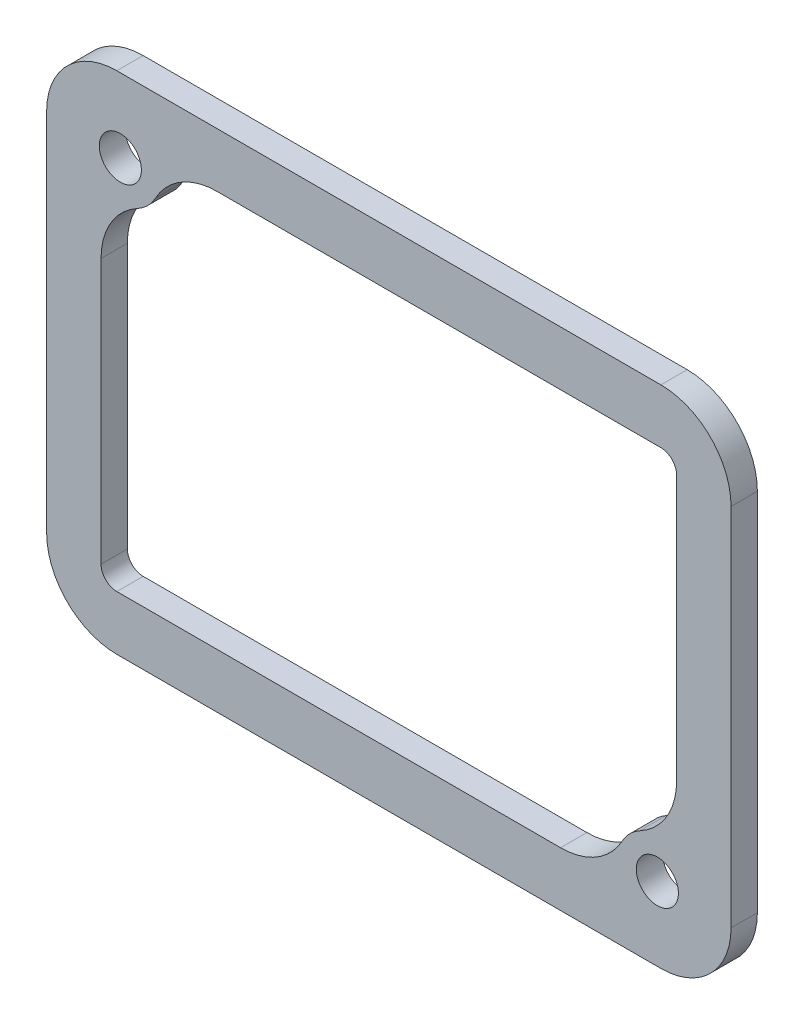
ISO-10303-21;
HEADER;
FILE_DESCRIPTION(('STEP AP214'),'2;1');
FILE_NAME('part.step','',(''),(''),'','','');
FILE_SCHEMA(('AUTOMOTIVE_DESIGN { 1 0 10303 214 1 1 1 1 }'));
ENDSEC;
DATA;
#1=APPLICATION_CONTEXT('core data for automotive mechanical design processes');
#2=APPLICATION_PROTOCOL_DEFINITION('international standard','automotive_design',2000,#1);
#3=PRODUCT_CONTEXT('',#1,'mechanical');
#4=PRODUCT('Part','Part','',(#3));
#5=PRODUCT_RELATED_PRODUCT_CATEGORY('part','',(#4));
#6=PRODUCT_DEFINITION_FORMATION('','',#4);
#7=PRODUCT_DEFINITION_CONTEXT('part definition',#1,'design');
#8=PRODUCT_DEFINITION('design','',#6,#7);
#9=PRODUCT_DEFINITION_SHAPE('','',#8);
#10=(LENGTH_UNIT() NAMED_UNIT(*) SI_UNIT(.MILLI.,.METRE.));
#11=(NAMED_UNIT(*) PLANE_ANGLE_UNIT() SI_UNIT($,.RADIAN.));
#12=(NAMED_UNIT(*) SI_UNIT($,.STERADIAN.) SOLID_ANGLE_UNIT());
#13=UNCERTAINTY_MEASURE_WITH_UNIT(LENGTH_MEASURE(1.E-05),#10,'distance_accuracy_value','');
#14=(GEOMETRIC_REPRESENTATION_CONTEXT(3) GLOBAL_UNCERTAINTY_ASSIGNED_CONTEXT((#13)) GLOBAL_UNIT_ASSIGNED_CONTEXT((#10,
#11,#12)) REPRESENTATION_CONTEXT('',''));
#15=CARTESIAN_POINT('',(0.,0.,0.));
#16=DIRECTION('',(0.,0.,1.));
#17=DIRECTION('',(1.,0.,0.));
#18=AXIS2_PLACEMENT_3D('',#15,#16,#17);
#19=CARTESIAN_POINT('',(-15.5,-10.4,1.5));
#20=DIRECTION('',(0.,0.,-1.));
#21=DIRECTION('',(-1.,0.,0.));
#22=AXIS2_PLACEMENT_3D('',#19,#20,#21);
#23=CYLINDRICAL_SURFACE('',#22,4.);
#24=CARTESIAN_POINT('',(-15.5,-10.4,0.));
#25=DIRECTION('',(0.,0.,1.));
#26=DIRECTION('',(-1.,0.,0.));
#27=AXIS2_PLACEMENT_3D('',#24,#25,#26);
#28=CIRCLE('',#27,4.);
#29=CARTESIAN_POINT('',(-19.5,-10.4,0.));
#30=VERTEX_POINT('',#29);
#31=CARTESIAN_POINT('',(-15.5,-14.4,0.));
#32=VERTEX_POINT('',#31);
#33=EDGE_CURVE('E260',#30,#32,#28,.T.);
#34=ORIENTED_EDGE('',*,*,#33,.T.);
#35=DIRECTION('',(0.,0.,-1.));
#36=VECTOR('',#35,1.);
#37=CARTESIAN_POINT('',(-15.5,-14.4,1.5));
#38=LINE('',#37,#36);
#39=CARTESIAN_POINT('',(-15.5,-14.4,1.5));
#40=VERTEX_POINT('',#39);
#41=EDGE_CURVE('E11',#40,#32,#38,.T.);
#42=ORIENTED_EDGE('',*,*,#41,.F.);
#43=CARTESIAN_POINT('',(-15.5,-10.4,1.5));
#44=DIRECTION('',(0.,0.,1.));
#45=DIRECTION('',(-1.,0.,0.));
#46=AXIS2_PLACEMENT_3D('',#43,#44,#45);
#47=CIRCLE('',#46,4.);
#48=CARTESIAN_POINT('',(-19.5,-10.4,1.5));
#49=VERTEX_POINT('',#48);
#50=EDGE_CURVE('E280',#49,#40,#47,.T.);
#51=ORIENTED_EDGE('',*,*,#50,.F.);
#52=DIRECTION('',(0.,0.,-1.));
#53=VECTOR('',#52,1.);
#54=CARTESIAN_POINT('',(-19.5,-10.4,1.5));
#55=LINE('',#54,#53);
#56=EDGE_CURVE('E298',#49,#30,#55,.T.);
#57=ORIENTED_EDGE('',*,*,#56,.T.);
#58=EDGE_LOOP('',(#34,#42,#51,#57));
#59=FACE_BOUND('',#58,.T.);
#60=ADVANCED_FACE('F39',(#59),#23,.T.);
#61=CARTESIAN_POINT('',(15.5,-14.4,1.5));
#62=DIRECTION('',(0.,1.,0.));
#63=DIRECTION('',(-1.,0.,0.));
#64=AXIS2_PLACEMENT_3D('',#61,#62,#63);
#65=PLANE('',#64);
#66=DIRECTION('',(1.,0.,0.));
#67=VECTOR('',#66,1.);
#68=CARTESIAN_POINT('',(15.5,-14.4,0.));
#69=LINE('',#68,#67);
#70=CARTESIAN_POINT('',(15.5,-14.4,0.));
#71=VERTEX_POINT('',#70);
#72=EDGE_CURVE('E301',#32,#71,#69,.T.);
#73=ORIENTED_EDGE('',*,*,#72,.T.);
#74=DIRECTION('',(0.,0.,-1.));
#75=VECTOR('',#74,1.);
#76=CARTESIAN_POINT('',(15.5,-14.4,1.5));
#77=LINE('',#76,#75);
#78=CARTESIAN_POINT('',(15.5,-14.4,1.5));
#79=VERTEX_POINT('',#78);
#80=EDGE_CURVE('E46',#79,#71,#77,.T.);
#81=ORIENTED_EDGE('',*,*,#80,.F.);
#82=DIRECTION('',(1.,0.,0.));
#83=VECTOR('',#82,1.);
#84=CARTESIAN_POINT('',(15.5,-14.4,1.5));
#85=LINE('',#84,#83);
#86=EDGE_CURVE('E283',#40,#79,#85,.T.);
#87=ORIENTED_EDGE('',*,*,#86,.F.);
#88=ORIENTED_EDGE('',*,*,#41,.T.);
#89=EDGE_LOOP('',(#73,#81,#87,#88));
#90=FACE_BOUND('',#89,.T.);
#91=ADVANCED_FACE('F356',(#90),#65,.F.);
#92=CARTESIAN_POINT('',(15.5,-10.4,1.5));
#93=DIRECTION('',(0.,0.,-1.));
#94=DIRECTION('',(-1.,0.,0.));
#95=AXIS2_PLACEMENT_3D('',#92,#93,#94);
#96=CYLINDRICAL_SURFACE('',#95,4.);
#97=CARTESIAN_POINT('',(15.5,-10.4,0.));
#98=DIRECTION('',(0.,0.,1.));
#99=DIRECTION('',(1.,0.,0.));
#100=AXIS2_PLACEMENT_3D('',#97,#98,#99);
#101=CIRCLE('',#100,4.);
#102=CARTESIAN_POINT('',(19.5,-10.4,0.));
#103=VERTEX_POINT('',#102);
#104=EDGE_CURVE('E303',#71,#103,#101,.T.);
#105=ORIENTED_EDGE('',*,*,#104,.T.);
#106=DIRECTION('',(0.,0.,-1.));
#107=VECTOR('',#106,1.);
#108=CARTESIAN_POINT('',(19.5,-10.4,1.5));
#109=LINE('',#108,#107);
#110=CARTESIAN_POINT('',(19.5,-10.4,1.5));
#111=VERTEX_POINT('',#110);
#112=EDGE_CURVE('E328',#111,#103,#109,.T.);
#113=ORIENTED_EDGE('',*,*,#112,.F.);
#114=CARTESIAN_POINT('',(15.5,-10.4,1.5));
#115=DIRECTION('',(0.,0.,1.));
#116=DIRECTION('',(1.,0.,0.));
#117=AXIS2_PLACEMENT_3D('',#114,#115,#116);
#118=CIRCLE('',#117,4.);
#119=EDGE_CURVE('E286',#79,#111,#118,.T.);
#120=ORIENTED_EDGE('',*,*,#119,.F.);
#121=ORIENTED_EDGE('',*,*,#80,.T.);
#122=EDGE_LOOP('',(#105,#113,#120,#121));
#123=FACE_BOUND('',#122,.T.);
#124=ADVANCED_FACE('F335',(#123),#96,.T.);
#125=CARTESIAN_POINT('',(19.5,-10.4,1.5));
#126=DIRECTION('',(-1.,0.,0.));
#127=DIRECTION('',(0.,0.,1.));
#128=AXIS2_PLACEMENT_3D('',#125,#126,#127);
#129=PLANE('',#128);
#130=DIRECTION('',(0.,1.,0.));
#131=VECTOR('',#130,1.);
#132=CARTESIAN_POINT('',(19.5,-10.4,0.));
#133=LINE('',#132,#131);
#134=CARTESIAN_POINT('',(19.5,10.4,0.));
#135=VERTEX_POINT('',#134);
#136=EDGE_CURVE('E305',#103,#135,#133,.T.);
#137=ORIENTED_EDGE('',*,*,#136,.T.);
#138=DIRECTION('',(0.,0.,-1.));
#139=VECTOR('',#138,1.);
#140=CARTESIAN_POINT('',(19.5,10.4,1.5));
#141=LINE('',#140,#139);
#142=CARTESIAN_POINT('',(19.5,10.4,1.5));
#143=VERTEX_POINT('',#142);
#144=EDGE_CURVE('E325',#143,#135,#141,.T.);
#145=ORIENTED_EDGE('',*,*,#144,.F.);
#146=DIRECTION('',(0.,1.,0.));
#147=VECTOR('',#146,1.);
#148=CARTESIAN_POINT('',(19.5,-10.4,1.5));
#149=LINE('',#148,#147);
#150=EDGE_CURVE('E288',#111,#143,#149,.T.);
#151=ORIENTED_EDGE('',*,*,#150,.F.);
#152=ORIENTED_EDGE('',*,*,#112,.T.);
#153=EDGE_LOOP('',(#137,#145,#151,#152));
#154=FACE_BOUND('',#153,.T.);
#155=ADVANCED_FACE('F344',(#154),#129,.F.);
#156=CARTESIAN_POINT('',(15.5,10.4,1.5));
#157=DIRECTION('',(0.,0.,-1.));
#158=DIRECTION('',(-1.,0.,0.));
#159=AXIS2_PLACEMENT_3D('',#156,#157,#158);
#160=CYLINDRICAL_SURFACE('',#159,4.);
#161=CARTESIAN_POINT('',(15.5,10.4,0.));
#162=DIRECTION('',(0.,0.,1.));
#163=DIRECTION('',(1.,0.,0.));
#164=AXIS2_PLACEMENT_3D('',#161,#162,#163);
#165=CIRCLE('',#164,4.);
#166=CARTESIAN_POINT('',(15.5,14.4,0.));
#167=VERTEX_POINT('',#166);
#168=EDGE_CURVE('E307',#135,#167,#165,.T.);
#169=ORIENTED_EDGE('',*,*,#168,.T.);
#170=DIRECTION('',(0.,0.,-1.));
#171=VECTOR('',#170,1.);
#172=CARTESIAN_POINT('',(15.5,14.4,1.5));
#173=LINE('',#172,#171);
#174=CARTESIAN_POINT('',(15.5,14.4,1.5));
#175=VERTEX_POINT('',#174);
#176=EDGE_CURVE('E322',#175,#167,#173,.T.);
#177=ORIENTED_EDGE('',*,*,#176,.F.);
#178=CARTESIAN_POINT('',(15.5,10.4,1.5));
#179=DIRECTION('',(0.,0.,1.));
#180=DIRECTION('',(1.,0.,0.));
#181=AXIS2_PLACEMENT_3D('',#178,#179,#180);
#182=CIRCLE('',#181,4.);
#183=EDGE_CURVE('E290',#143,#175,#182,.T.);
#184=ORIENTED_EDGE('',*,*,#183,.F.);
#185=ORIENTED_EDGE('',*,*,#144,.T.);
#186=EDGE_LOOP('',(#169,#177,#184,#185));
#187=FACE_BOUND('',#186,.T.);
#188=ADVANCED_FACE('F348',(#187),#160,.T.);
#189=CARTESIAN_POINT('',(15.5,14.4,1.5));
#190=DIRECTION('',(0.,-1.,0.));
#191=DIRECTION('',(1.,0.,0.));
#192=AXIS2_PLACEMENT_3D('',#189,#190,#191);
#193=PLANE('',#192);
#194=DIRECTION('',(-1.,0.,0.));
#195=VECTOR('',#194,1.);
#196=CARTESIAN_POINT('',(15.5,14.4,0.));
#197=LINE('',#196,#195);
#198=CARTESIAN_POINT('',(-15.5,14.4,0.));
#199=VERTEX_POINT('',#198);
#200=EDGE_CURVE('E309',#167,#199,#197,.T.);
#201=ORIENTED_EDGE('',*,*,#200,.T.);
#202=DIRECTION('',(0.,0.,-1.));
#203=VECTOR('',#202,1.);
#204=CARTESIAN_POINT('',(-15.5,14.4,1.5));
#205=LINE('',#204,#203);
#206=CARTESIAN_POINT('',(-15.5,14.4,1.5));
#207=VERTEX_POINT('',#206);
#208=EDGE_CURVE('E319',#207,#199,#205,.T.);
#209=ORIENTED_EDGE('',*,*,#208,.F.);
#210=DIRECTION('',(-1.,0.,0.));
#211=VECTOR('',#210,1.);
#212=CARTESIAN_POINT('',(15.5,14.4,1.5));
#213=LINE('',#212,#211);
#214=EDGE_CURVE('E292',#175,#207,#213,.T.);
#215=ORIENTED_EDGE('',*,*,#214,.F.);
#216=ORIENTED_EDGE('',*,*,#176,.T.);
#217=EDGE_LOOP('',(#201,#209,#215,#216));
#218=FACE_BOUND('',#217,.T.);
#219=ADVANCED_FACE('F369',(#218),#193,.F.);
#220=CARTESIAN_POINT('',(-15.5,10.4,1.5));
#221=DIRECTION('',(0.,0.,-1.));
#222=DIRECTION('',(-1.,0.,0.));
#223=AXIS2_PLACEMENT_3D('',#220,#221,#222);
#224=CYLINDRICAL_SURFACE('',#223,4.);
#225=CARTESIAN_POINT('',(-15.5,10.4,0.));
#226=DIRECTION('',(0.,0.,1.));
#227=DIRECTION('',(1.,0.,0.));
#228=AXIS2_PLACEMENT_3D('',#225,#226,#227);
#229=CIRCLE('',#228,4.);
#230=CARTESIAN_POINT('',(-19.5,10.4,0.));
#231=VERTEX_POINT('',#230);
#232=EDGE_CURVE('E311',#199,#231,#229,.T.);
#233=ORIENTED_EDGE('',*,*,#232,.T.);
#234=DIRECTION('',(0.,0.,-1.));
#235=VECTOR('',#234,1.);
#236=CARTESIAN_POINT('',(-19.5,10.4,1.5));
#237=LINE('',#236,#235);
#238=CARTESIAN_POINT('',(-19.5,10.4,1.5));
#239=VERTEX_POINT('',#238);
#240=EDGE_CURVE('E316',#239,#231,#237,.T.);
#241=ORIENTED_EDGE('',*,*,#240,.F.);
#242=CARTESIAN_POINT('',(-15.5,10.4,1.5));
#243=DIRECTION('',(0.,0.,1.));
#244=DIRECTION('',(1.,0.,0.));
#245=AXIS2_PLACEMENT_3D('',#242,#243,#244);
#246=CIRCLE('',#245,4.);
#247=EDGE_CURVE('E294',#207,#239,#246,.T.);
#248=ORIENTED_EDGE('',*,*,#247,.F.);
#249=ORIENTED_EDGE('',*,*,#208,.T.);
#250=EDGE_LOOP('',(#233,#241,#248,#249));
#251=FACE_BOUND('',#250,.T.);
#252=ADVANCED_FACE('F367',(#251),#224,.T.);
#253=CARTESIAN_POINT('',(-19.5,-10.4,1.5));
#254=DIRECTION('',(1.,0.,0.));
#255=DIRECTION('',(0.,1.,0.));
#256=AXIS2_PLACEMENT_3D('',#253,#254,#255);
#257=PLANE('',#256);
#258=DIRECTION('',(0.,-1.,0.));
#259=VECTOR('',#258,1.);
#260=CARTESIAN_POINT('',(-19.5,-10.4,0.));
#261=LINE('',#260,#259);
#262=EDGE_CURVE('E284',#231,#30,#261,.T.);
#263=ORIENTED_EDGE('',*,*,#262,.T.);
#264=ORIENTED_EDGE('',*,*,#56,.F.);
#265=DIRECTION('',(0.,-1.,0.));
#266=VECTOR('',#265,1.);
#267=CARTESIAN_POINT('',(-19.5,-10.4,1.5));
#268=LINE('',#267,#266);
#269=EDGE_CURVE('E296',#239,#49,#268,.T.);
#270=ORIENTED_EDGE('',*,*,#269,.F.);
#271=ORIENTED_EDGE('',*,*,#240,.T.);
#272=EDGE_LOOP('',(#263,#264,#270,#271));
#273=FACE_BOUND('',#272,.T.);
#274=ADVANCED_FACE('F362',(#273),#257,.F.);
#275=CARTESIAN_POINT('',(-15.5,-10.4,1.5));
#276=DIRECTION('',(0.,0.,-1.));
#277=DIRECTION('',(-1.,0.,0.));
#278=AXIS2_PLACEMENT_3D('',#275,#276,#277);
#279=PLANE('',#278);
#280=CARTESIAN_POINT('',(-15.3,10.2,1.5));
#281=DIRECTION('',(0.,0.,1.));
#282=DIRECTION('',(1.,0.,0.));
#283=AXIS2_PLACEMENT_3D('',#280,#281,#282);
#284=CIRCLE('',#283,1.2);
#285=CARTESIAN_POINT('',(-14.1,10.2,1.5));
#286=VERTEX_POINT('',#285);
#287=EDGE_CURVE('E577',#286,#286,#284,.T.);
#288=ORIENTED_EDGE('',*,*,#287,.F.);
#289=EDGE_LOOP('',(#288));
#290=FACE_BOUND('',#289,.T.);
#291=CARTESIAN_POINT('',(15.3,-10.2,1.5));
#292=DIRECTION('',(0.,0.,1.));
#293=DIRECTION('',(1.,0.,0.));
#294=AXIS2_PLACEMENT_3D('',#291,#292,#293);
#295=CIRCLE('',#294,1.2);
#296=CARTESIAN_POINT('',(16.5,-10.2,1.5));
#297=VERTEX_POINT('',#296);
#298=EDGE_CURVE('E578',#297,#297,#295,.T.);
#299=ORIENTED_EDGE('',*,*,#298,.F.);
#300=EDGE_LOOP('',(#299));
#301=FACE_BOUND('',#300,.T.);
#302=DIRECTION('',(-1.,0.,0.));
#303=VECTOR('',#302,1.);
#304=CARTESIAN_POINT('',(15.5,11.3,1.5));
#305=LINE('',#304,#303);
#306=CARTESIAN_POINT('',(15.5,11.3,1.5));
#307=VERTEX_POINT('',#306);
#308=CARTESIAN_POINT('',(-9.78685725716573,11.3,1.5));
#309=VERTEX_POINT('',#308);
#310=EDGE_CURVE('E229',#307,#309,#305,.T.);
#311=ORIENTED_EDGE('',*,*,#310,.F.);
#312=CARTESIAN_POINT('',(15.5,10.4,1.5));
#313=DIRECTION('',(0.,0.,1.));
#314=DIRECTION('',(1.,0.,0.));
#315=AXIS2_PLACEMENT_3D('',#312,#313,#314);
#316=CIRCLE('',#315,0.899999999999998);
#317=CARTESIAN_POINT('',(16.4,10.4,1.5));
#318=VERTEX_POINT('',#317);
#319=EDGE_CURVE('E53',#318,#307,#316,.T.);
#320=ORIENTED_EDGE('',*,*,#319,.F.);
#321=DIRECTION('',(0.,1.,0.));
#322=VECTOR('',#321,1.);
#323=CARTESIAN_POINT('',(16.4,-4.68685725716572,1.5));
#324=LINE('',#323,#322);
#325=CARTESIAN_POINT('',(16.4,-4.68685725716572,1.5));
#326=VERTEX_POINT('',#325);
#327=EDGE_CURVE('E194',#326,#318,#324,.T.);
#328=ORIENTED_EDGE('',*,*,#327,.F.);
#329=CARTESIAN_POINT('',(12.4,-4.68685725716572,1.5));
#330=DIRECTION('',(0.,0.,1.));
#331=DIRECTION('',(1.,0.,0.));
#332=AXIS2_PLACEMENT_3D('',#329,#330,#331);
#333=CIRCLE('',#332,4.);
#334=CARTESIAN_POINT('',(14.3076923076923,-8.2026374066022,1.5));
#335=VERTEX_POINT('',#334);
#336=EDGE_CURVE('E197',#335,#326,#333,.T.);
#337=ORIENTED_EDGE('',*,*,#336,.F.);
#338=CARTESIAN_POINT('',(15.5,-10.4,1.5));
#339=DIRECTION('',(0.,0.,-1.));
#340=DIRECTION('',(1.,0.,0.));
#341=AXIS2_PLACEMENT_3D('',#338,#339,#340);
#342=CIRCLE('',#341,2.5);
#343=CARTESIAN_POINT('',(13.3026374066022,-9.20769230769231,1.5));
#344=VERTEX_POINT('',#343);
#345=EDGE_CURVE('E253',#344,#335,#342,.T.);
#346=ORIENTED_EDGE('',*,*,#345,.F.);
#347=CARTESIAN_POINT('',(9.78685725716572,-7.3,1.5));
#348=DIRECTION('',(0.,0.,1.));
#349=DIRECTION('',(-1.,0.,0.));
#350=AXIS2_PLACEMENT_3D('',#347,#348,#349);
#351=CIRCLE('',#350,4.);
#352=CARTESIAN_POINT('',(9.78685725716572,-11.3,1.5));
#353=VERTEX_POINT('',#352);
#354=EDGE_CURVE('E250',#353,#344,#351,.T.);
#355=ORIENTED_EDGE('',*,*,#354,.F.);
#356=DIRECTION('',(1.,0.,0.));
#357=VECTOR('',#356,1.);
#358=CARTESIAN_POINT('',(-15.5,-11.3,1.5));
#359=LINE('',#358,#357);
#360=CARTESIAN_POINT('',(-15.5,-11.3,1.5));
#361=VERTEX_POINT('',#360);
#362=EDGE_CURVE('E247',#361,#353,#359,.T.);
#363=ORIENTED_EDGE('',*,*,#362,.F.);
#364=CARTESIAN_POINT('',(-15.5,-10.4,1.5));
#365=DIRECTION('',(0.,0.,1.));
#366=DIRECTION('',(1.,0.,0.));
#367=AXIS2_PLACEMENT_3D('',#364,#365,#366);
#368=CIRCLE('',#367,0.899999999999995);
#369=CARTESIAN_POINT('',(-16.4,-10.4,1.5));
#370=VERTEX_POINT('',#369);
#371=EDGE_CURVE('E244',#370,#361,#368,.T.);
#372=ORIENTED_EDGE('',*,*,#371,.F.);
#373=DIRECTION('',(0.,-1.,0.));
#374=VECTOR('',#373,1.);
#375=CARTESIAN_POINT('',(-16.4,4.68685725716572,1.5));
#376=LINE('',#375,#374);
#377=CARTESIAN_POINT('',(-16.4,4.68685725716572,1.5));
#378=VERTEX_POINT('',#377);
#379=EDGE_CURVE('E241',#378,#370,#376,.T.);
#380=ORIENTED_EDGE('',*,*,#379,.F.);
#381=CARTESIAN_POINT('',(-12.4,4.68685725716572,1.5));
#382=DIRECTION('',(0.,0.,1.));
#383=DIRECTION('',(1.,0.,0.));
#384=AXIS2_PLACEMENT_3D('',#381,#382,#383);
#385=CIRCLE('',#384,4.);
#386=CARTESIAN_POINT('',(-14.3076923076923,8.2026374066022,1.5));
#387=VERTEX_POINT('',#386);
#388=EDGE_CURVE('E238',#387,#378,#385,.T.);
#389=ORIENTED_EDGE('',*,*,#388,.F.);
#390=CARTESIAN_POINT('',(-15.5,10.4,1.5));
#391=DIRECTION('',(0.,0.,-1.));
#392=DIRECTION('',(1.,0.,0.));
#393=AXIS2_PLACEMENT_3D('',#390,#391,#392);
#394=CIRCLE('',#393,2.5);
#395=CARTESIAN_POINT('',(-13.3026374066022,9.2076923076923,1.5));
#396=VERTEX_POINT('',#395);
#397=EDGE_CURVE('E235',#396,#387,#394,.T.);
#398=ORIENTED_EDGE('',*,*,#397,.F.);
#399=CARTESIAN_POINT('',(-9.78685725716573,7.29999999999999,1.5));
#400=DIRECTION('',(0.,0.,1.));
#401=DIRECTION('',(-1.,0.,0.));
#402=AXIS2_PLACEMENT_3D('',#399,#400,#401);
#403=CIRCLE('',#402,4.);
#404=EDGE_CURVE('E232',#309,#396,#403,.T.);
#405=ORIENTED_EDGE('',*,*,#404,.F.);
#406=EDGE_LOOP('',(#311,#320,#328,#337,#346,#355,#363,#372,#380,#389,#398,#405));
#407=FACE_BOUND('',#406,.T.);
#408=ORIENTED_EDGE('',*,*,#50,.T.);
#409=ORIENTED_EDGE('',*,*,#86,.T.);
#410=ORIENTED_EDGE('',*,*,#119,.T.);
#411=ORIENTED_EDGE('',*,*,#150,.T.);
#412=ORIENTED_EDGE('',*,*,#183,.T.);
#413=ORIENTED_EDGE('',*,*,#214,.T.);
#414=ORIENTED_EDGE('',*,*,#247,.T.);
#415=ORIENTED_EDGE('',*,*,#269,.T.);
#416=EDGE_LOOP('',(#408,#409,#410,#411,#412,#413,#414,#415));
#417=FACE_BOUND('',#416,.T.);
#418=ADVANCED_FACE('F352',(#290,#301,#407,#417),#279,.F.);
#419=CARTESIAN_POINT('',(-15.5,-10.4,0.));
#420=DIRECTION('',(0.,0.,-1.));
#421=DIRECTION('',(-1.,0.,0.));
#422=AXIS2_PLACEMENT_3D('',#419,#420,#421);
#423=PLANE('',#422);
#424=CARTESIAN_POINT('',(-15.3,10.2,0.));
#425=DIRECTION('',(0.,0.,1.));
#426=DIRECTION('',(1.,0.,0.));
#427=AXIS2_PLACEMENT_3D('',#424,#425,#426);
#428=CIRCLE('',#427,1.2);
#429=CARTESIAN_POINT('',(-14.1,10.2,0.));
#430=VERTEX_POINT('',#429);
#431=EDGE_CURVE('E230',#430,#430,#428,.T.);
#432=ORIENTED_EDGE('',*,*,#431,.T.);
#433=EDGE_LOOP('',(#432));
#434=FACE_BOUND('',#433,.T.);
#435=CARTESIAN_POINT('',(15.3,-10.2,0.));
#436=DIRECTION('',(0.,0.,1.));
#437=DIRECTION('',(1.,0.,0.));
#438=AXIS2_PLACEMENT_3D('',#435,#436,#437);
#439=CIRCLE('',#438,1.2);
#440=CARTESIAN_POINT('',(16.5,-10.2,0.));
#441=VERTEX_POINT('',#440);
#442=EDGE_CURVE('E200',#441,#441,#439,.T.);
#443=ORIENTED_EDGE('',*,*,#442,.T.);
#444=EDGE_LOOP('',(#443));
#445=FACE_BOUND('',#444,.T.);
#446=CARTESIAN_POINT('',(15.5,10.4,0.));
#447=DIRECTION('',(0.,0.,1.));
#448=DIRECTION('',(1.,0.,0.));
#449=AXIS2_PLACEMENT_3D('',#446,#447,#448);
#450=CIRCLE('',#449,0.899999999999998);
#451=CARTESIAN_POINT('',(16.4,10.4,0.));
#452=VERTEX_POINT('',#451);
#453=CARTESIAN_POINT('',(15.5,11.3,0.));
#454=VERTEX_POINT('',#453);
#455=EDGE_CURVE('E177',#452,#454,#450,.T.);
#456=ORIENTED_EDGE('',*,*,#455,.T.);
#457=DIRECTION('',(-1.,0.,0.));
#458=VECTOR('',#457,1.);
#459=CARTESIAN_POINT('',(15.5,11.3,0.));
#460=LINE('',#459,#458);
#461=CARTESIAN_POINT('',(-9.78685725716573,11.3,0.));
#462=VERTEX_POINT('',#461);
#463=EDGE_CURVE('E186',#454,#462,#460,.T.);
#464=ORIENTED_EDGE('',*,*,#463,.T.);
#465=CARTESIAN_POINT('',(-9.78685725716573,7.29999999999999,0.));
#466=DIRECTION('',(0.,0.,1.));
#467=DIRECTION('',(-1.,0.,0.));
#468=AXIS2_PLACEMENT_3D('',#465,#466,#467);
#469=CIRCLE('',#468,4.);
#470=CARTESIAN_POINT('',(-13.3026374066022,9.2076923076923,0.));
#471=VERTEX_POINT('',#470);
#472=EDGE_CURVE('E61',#462,#471,#469,.T.);
#473=ORIENTED_EDGE('',*,*,#472,.T.);
#474=CARTESIAN_POINT('',(-15.5,10.4,0.));
#475=DIRECTION('',(0.,0.,-1.));
#476=DIRECTION('',(1.,0.,0.));
#477=AXIS2_PLACEMENT_3D('',#474,#475,#476);
#478=CIRCLE('',#477,2.5);
#479=CARTESIAN_POINT('',(-14.3076923076923,8.2026374066022,0.));
#480=VERTEX_POINT('',#479);
#481=EDGE_CURVE('E204',#471,#480,#478,.T.);
#482=ORIENTED_EDGE('',*,*,#481,.T.);
#483=CARTESIAN_POINT('',(-12.4,4.68685725716572,0.));
#484=DIRECTION('',(0.,0.,1.));
#485=DIRECTION('',(1.,0.,0.));
#486=AXIS2_PLACEMENT_3D('',#483,#484,#485);
#487=CIRCLE('',#486,4.);
#488=CARTESIAN_POINT('',(-16.4,4.68685725716572,0.));
#489=VERTEX_POINT('',#488);
#490=EDGE_CURVE('E207',#480,#489,#487,.T.);
#491=ORIENTED_EDGE('',*,*,#490,.T.);
#492=DIRECTION('',(0.,-1.,0.));
#493=VECTOR('',#492,1.);
#494=CARTESIAN_POINT('',(-16.4,4.68685725716572,0.));
#495=LINE('',#494,#493);
#496=CARTESIAN_POINT('',(-16.4,-10.4,0.));
#497=VERTEX_POINT('',#496);
#498=EDGE_CURVE('E210',#489,#497,#495,.T.);
#499=ORIENTED_EDGE('',*,*,#498,.T.);
#500=CARTESIAN_POINT('',(-15.5,-10.4,0.));
#501=DIRECTION('',(0.,0.,1.));
#502=DIRECTION('',(1.,0.,0.));
#503=AXIS2_PLACEMENT_3D('',#500,#501,#502);
#504=CIRCLE('',#503,0.899999999999995);
#505=CARTESIAN_POINT('',(-15.5,-11.3,0.));
#506=VERTEX_POINT('',#505);
#507=EDGE_CURVE('E213',#497,#506,#504,.T.);
#508=ORIENTED_EDGE('',*,*,#507,.T.);
#509=DIRECTION('',(1.,0.,0.));
#510=VECTOR('',#509,1.);
#511=CARTESIAN_POINT('',(-15.5,-11.3,0.));
#512=LINE('',#511,#510);
#513=CARTESIAN_POINT('',(9.78685725716572,-11.3,0.));
#514=VERTEX_POINT('',#513);
#515=EDGE_CURVE('E216',#506,#514,#512,.T.);
#516=ORIENTED_EDGE('',*,*,#515,.T.);
#517=CARTESIAN_POINT('',(9.78685725716572,-7.3,0.));
#518=DIRECTION('',(0.,0.,1.));
#519=DIRECTION('',(-1.,0.,0.));
#520=AXIS2_PLACEMENT_3D('',#517,#518,#519);
#521=CIRCLE('',#520,4.);
#522=CARTESIAN_POINT('',(13.3026374066022,-9.20769230769231,0.));
#523=VERTEX_POINT('',#522);
#524=EDGE_CURVE('E219',#514,#523,#521,.T.);
#525=ORIENTED_EDGE('',*,*,#524,.T.);
#526=CARTESIAN_POINT('',(15.5,-10.4,0.));
#527=DIRECTION('',(0.,0.,-1.));
#528=DIRECTION('',(1.,0.,0.));
#529=AXIS2_PLACEMENT_3D('',#526,#527,#528);
#530=CIRCLE('',#529,2.5);
#531=CARTESIAN_POINT('',(14.3076923076923,-8.2026374066022,0.));
#532=VERTEX_POINT('',#531);
#533=EDGE_CURVE('E222',#523,#532,#530,.T.);
#534=ORIENTED_EDGE('',*,*,#533,.T.);
#535=CARTESIAN_POINT('',(12.4,-4.68685725716572,0.));
#536=DIRECTION('',(0.,0.,1.));
#537=DIRECTION('',(1.,0.,0.));
#538=AXIS2_PLACEMENT_3D('',#535,#536,#537);
#539=CIRCLE('',#538,4.);
#540=CARTESIAN_POINT('',(16.4,-4.68685725716572,0.));
#541=VERTEX_POINT('',#540);
#542=EDGE_CURVE('E225',#532,#541,#539,.T.);
#543=ORIENTED_EDGE('',*,*,#542,.T.);
#544=DIRECTION('',(0.,1.,0.));
#545=VECTOR('',#544,1.);
#546=CARTESIAN_POINT('',(16.4,-4.68685725716572,0.));
#547=LINE('',#546,#545);
#548=EDGE_CURVE('E183',#541,#452,#547,.T.);
#549=ORIENTED_EDGE('',*,*,#548,.T.);
#550=EDGE_LOOP('',(#456,#464,#473,#482,#491,#499,#508,#516,#525,#534,#543,#549));
#551=FACE_BOUND('',#550,.T.);
#552=ORIENTED_EDGE('',*,*,#33,.F.);
#553=ORIENTED_EDGE('',*,*,#262,.F.);
#554=ORIENTED_EDGE('',*,*,#232,.F.);
#555=ORIENTED_EDGE('',*,*,#200,.F.);
#556=ORIENTED_EDGE('',*,*,#168,.F.);
#557=ORIENTED_EDGE('',*,*,#136,.F.);
#558=ORIENTED_EDGE('',*,*,#104,.F.);
#559=ORIENTED_EDGE('',*,*,#72,.F.);
#560=EDGE_LOOP('',(#552,#553,#554,#555,#556,#557,#558,#559));
#561=FACE_BOUND('',#560,.T.);
#562=ADVANCED_FACE('F190',(#434,#445,#551,#561),#423,.T.);
#563=CARTESIAN_POINT('',(15.5,10.4,0.));
#564=DIRECTION('',(0.,0.,1.));
#565=DIRECTION('',(1.,0.,0.));
#566=AXIS2_PLACEMENT_3D('',#563,#564,#565);
#567=CYLINDRICAL_SURFACE('',#566,0.899999999999998);
#568=ORIENTED_EDGE('',*,*,#319,.T.);
#569=DIRECTION('',(0.,0.,1.));
#570=VECTOR('',#569,1.);
#571=CARTESIAN_POINT('',(15.5,11.3,0.));
#572=LINE('',#571,#570);
#573=EDGE_CURVE('E173',#454,#307,#572,.T.);
#574=ORIENTED_EDGE('',*,*,#573,.F.);
#575=ORIENTED_EDGE('',*,*,#455,.F.);
#576=DIRECTION('',(0.,0.,1.));
#577=VECTOR('',#576,1.);
#578=CARTESIAN_POINT('',(16.4,10.4,0.));
#579=LINE('',#578,#577);
#580=EDGE_CURVE('E258',#452,#318,#579,.T.);
#581=ORIENTED_EDGE('',*,*,#580,.T.);
#582=EDGE_LOOP('',(#568,#574,#575,#581));
#583=FACE_BOUND('',#582,.T.);
#584=ADVANCED_FACE('F175',(#583),#567,.F.);
#585=CARTESIAN_POINT('',(16.4,-4.68685725716572,0.));
#586=DIRECTION('',(1.,0.,0.));
#587=DIRECTION('',(0.,0.,-1.));
#588=AXIS2_PLACEMENT_3D('',#585,#586,#587);
#589=PLANE('',#588);
#590=ORIENTED_EDGE('',*,*,#327,.T.);
#591=ORIENTED_EDGE('',*,*,#580,.F.);
#592=ORIENTED_EDGE('',*,*,#548,.F.);
#593=DIRECTION('',(0.,0.,1.));
#594=VECTOR('',#593,1.);
#595=CARTESIAN_POINT('',(16.4,-4.68685725716572,0.));
#596=LINE('',#595,#594);
#597=EDGE_CURVE('E261',#541,#326,#596,.T.);
#598=ORIENTED_EDGE('',*,*,#597,.T.);
#599=EDGE_LOOP('',(#590,#591,#592,#598));
#600=FACE_BOUND('',#599,.T.);
#601=ADVANCED_FACE('F445',(#600),#589,.F.);
#602=CARTESIAN_POINT('',(12.4,-4.68685725716572,0.));
#603=DIRECTION('',(0.,0.,1.));
#604=DIRECTION('',(1.,0.,0.));
#605=AXIS2_PLACEMENT_3D('',#602,#603,#604);
#606=CYLINDRICAL_SURFACE('',#605,4.);
#607=ORIENTED_EDGE('',*,*,#336,.T.);
#608=ORIENTED_EDGE('',*,*,#597,.F.);
#609=ORIENTED_EDGE('',*,*,#542,.F.);
#610=DIRECTION('',(0.,0.,1.));
#611=VECTOR('',#610,1.);
#612=CARTESIAN_POINT('',(14.3076923076923,-8.2026374066022,0.));
#613=LINE('',#612,#611);
#614=EDGE_CURVE('E263',#532,#335,#613,.T.);
#615=ORIENTED_EDGE('',*,*,#614,.T.);
#616=EDGE_LOOP('',(#607,#608,#609,#615));
#617=FACE_BOUND('',#616,.T.);
#618=ADVANCED_FACE('F454',(#617),#606,.F.);
#619=CARTESIAN_POINT('',(15.5,-10.4,0.));
#620=DIRECTION('',(0.,0.,1.));
#621=DIRECTION('',(1.,0.,0.));
#622=AXIS2_PLACEMENT_3D('',#619,#620,#621);
#623=CYLINDRICAL_SURFACE('',#622,2.5);
#624=ORIENTED_EDGE('',*,*,#345,.T.);
#625=ORIENTED_EDGE('',*,*,#614,.F.);
#626=ORIENTED_EDGE('',*,*,#533,.F.);
#627=DIRECTION('',(0.,0.,1.));
#628=VECTOR('',#627,1.);
#629=CARTESIAN_POINT('',(13.3026374066022,-9.20769230769231,0.));
#630=LINE('',#629,#628);
#631=EDGE_CURVE('E265',#523,#344,#630,.T.);
#632=ORIENTED_EDGE('',*,*,#631,.T.);
#633=EDGE_LOOP('',(#624,#625,#626,#632));
#634=FACE_BOUND('',#633,.T.);
#635=ADVANCED_FACE('F464',(#634),#623,.T.);
#636=CARTESIAN_POINT('',(9.78685725716572,-7.3,0.));
#637=DIRECTION('',(0.,0.,1.));
#638=DIRECTION('',(1.,0.,0.));
#639=AXIS2_PLACEMENT_3D('',#636,#637,#638);
#640=CYLINDRICAL_SURFACE('',#639,4.);
#641=ORIENTED_EDGE('',*,*,#354,.T.);
#642=ORIENTED_EDGE('',*,*,#631,.F.);
#643=ORIENTED_EDGE('',*,*,#524,.F.);
#644=DIRECTION('',(0.,0.,1.));
#645=VECTOR('',#644,1.);
#646=CARTESIAN_POINT('',(9.78685725716572,-11.3,0.));
#647=LINE('',#646,#645);
#648=EDGE_CURVE('E267',#514,#353,#647,.T.);
#649=ORIENTED_EDGE('',*,*,#648,.T.);
#650=EDGE_LOOP('',(#641,#642,#643,#649));
#651=FACE_BOUND('',#650,.T.);
#652=ADVANCED_FACE('F474',(#651),#640,.F.);
#653=CARTESIAN_POINT('',(-15.5,-11.3,0.));
#654=DIRECTION('',(0.,-1.,0.));
#655=DIRECTION('',(1.,0.,0.));
#656=AXIS2_PLACEMENT_3D('',#653,#654,#655);
#657=PLANE('',#656);
#658=ORIENTED_EDGE('',*,*,#362,.T.);
#659=ORIENTED_EDGE('',*,*,#648,.F.);
#660=ORIENTED_EDGE('',*,*,#515,.F.);
#661=DIRECTION('',(0.,0.,1.));
#662=VECTOR('',#661,1.);
#663=CARTESIAN_POINT('',(-15.5,-11.3,0.));
#664=LINE('',#663,#662);
#665=EDGE_CURVE('E269',#506,#361,#664,.T.);
#666=ORIENTED_EDGE('',*,*,#665,.T.);
#667=EDGE_LOOP('',(#658,#659,#660,#666));
#668=FACE_BOUND('',#667,.T.);
#669=ADVANCED_FACE('F484',(#668),#657,.F.);
#670=CARTESIAN_POINT('',(-15.5,-10.4,0.));
#671=DIRECTION('',(0.,0.,1.));
#672=DIRECTION('',(1.,0.,0.));
#673=AXIS2_PLACEMENT_3D('',#670,#671,#672);
#674=CYLINDRICAL_SURFACE('',#673,0.899999999999995);
#675=ORIENTED_EDGE('',*,*,#371,.T.);
#676=ORIENTED_EDGE('',*,*,#665,.F.);
#677=ORIENTED_EDGE('',*,*,#507,.F.);
#678=DIRECTION('',(0.,0.,1.));
#679=VECTOR('',#678,1.);
#680=CARTESIAN_POINT('',(-16.4,-10.4,0.));
#681=LINE('',#680,#679);
#682=EDGE_CURVE('E271',#497,#370,#681,.T.);
#683=ORIENTED_EDGE('',*,*,#682,.T.);
#684=EDGE_LOOP('',(#675,#676,#677,#683));
#685=FACE_BOUND('',#684,.T.);
#686=ADVANCED_FACE('F494',(#685),#674,.F.);
#687=CARTESIAN_POINT('',(-16.4,4.68685725716572,0.));
#688=DIRECTION('',(-1.,0.,0.));
#689=DIRECTION('',(0.,0.,1.));
#690=AXIS2_PLACEMENT_3D('',#687,#688,#689);
#691=PLANE('',#690);
#692=ORIENTED_EDGE('',*,*,#379,.T.);
#693=ORIENTED_EDGE('',*,*,#682,.F.);
#694=ORIENTED_EDGE('',*,*,#498,.F.);
#695=DIRECTION('',(0.,0.,1.));
#696=VECTOR('',#695,1.);
#697=CARTESIAN_POINT('',(-16.4,4.68685725716572,0.));
#698=LINE('',#697,#696);
#699=EDGE_CURVE('E273',#489,#378,#698,.T.);
#700=ORIENTED_EDGE('',*,*,#699,.T.);
#701=EDGE_LOOP('',(#692,#693,#694,#700));
#702=FACE_BOUND('',#701,.T.);
#703=ADVANCED_FACE('F504',(#702),#691,.F.);
#704=CARTESIAN_POINT('',(-12.4,4.68685725716572,0.));
#705=DIRECTION('',(0.,0.,1.));
#706=DIRECTION('',(1.,0.,0.));
#707=AXIS2_PLACEMENT_3D('',#704,#705,#706);
#708=CYLINDRICAL_SURFACE('',#707,4.);
#709=ORIENTED_EDGE('',*,*,#388,.T.);
#710=ORIENTED_EDGE('',*,*,#699,.F.);
#711=ORIENTED_EDGE('',*,*,#490,.F.);
#712=DIRECTION('',(0.,0.,1.));
#713=VECTOR('',#712,1.);
#714=CARTESIAN_POINT('',(-14.3076923076923,8.2026374066022,0.));
#715=LINE('',#714,#713);
#716=EDGE_CURVE('E275',#480,#387,#715,.T.);
#717=ORIENTED_EDGE('',*,*,#716,.T.);
#718=EDGE_LOOP('',(#709,#710,#711,#717));
#719=FACE_BOUND('',#718,.T.);
#720=ADVANCED_FACE('F514',(#719),#708,.F.);
#721=CARTESIAN_POINT('',(-15.5,10.4,0.));
#722=DIRECTION('',(0.,0.,1.));
#723=DIRECTION('',(1.,0.,0.));
#724=AXIS2_PLACEMENT_3D('',#721,#722,#723);
#725=CYLINDRICAL_SURFACE('',#724,2.5);
#726=ORIENTED_EDGE('',*,*,#397,.T.);
#727=ORIENTED_EDGE('',*,*,#716,.F.);
#728=ORIENTED_EDGE('',*,*,#481,.F.);
#729=DIRECTION('',(0.,0.,1.));
#730=VECTOR('',#729,1.);
#731=CARTESIAN_POINT('',(-13.3026374066022,9.2076923076923,0.));
#732=LINE('',#731,#730);
#733=EDGE_CURVE('E277',#471,#396,#732,.T.);
#734=ORIENTED_EDGE('',*,*,#733,.T.);
#735=EDGE_LOOP('',(#726,#727,#728,#734));
#736=FACE_BOUND('',#735,.T.);
#737=ADVANCED_FACE('F524',(#736),#725,.T.);
#738=CARTESIAN_POINT('',(-9.78685725716573,7.29999999999999,0.));
#739=DIRECTION('',(0.,0.,1.));
#740=DIRECTION('',(1.,0.,0.));
#741=AXIS2_PLACEMENT_3D('',#738,#739,#740);
#742=CYLINDRICAL_SURFACE('',#741,4.);
#743=ORIENTED_EDGE('',*,*,#404,.T.);
#744=ORIENTED_EDGE('',*,*,#733,.F.);
#745=ORIENTED_EDGE('',*,*,#472,.F.);
#746=DIRECTION('',(0.,0.,1.));
#747=VECTOR('',#746,1.);
#748=CARTESIAN_POINT('',(-9.78685725716573,11.3,0.));
#749=LINE('',#748,#747);
#750=EDGE_CURVE('E182',#462,#309,#749,.T.);
#751=ORIENTED_EDGE('',*,*,#750,.T.);
#752=EDGE_LOOP('',(#743,#744,#745,#751));
#753=FACE_BOUND('',#752,.T.);
#754=ADVANCED_FACE('F534',(#753),#742,.F.);
#755=CARTESIAN_POINT('',(15.5,11.3,0.));
#756=DIRECTION('',(0.,1.,0.));
#757=DIRECTION('',(-1.,0.,0.));
#758=AXIS2_PLACEMENT_3D('',#755,#756,#757);
#759=PLANE('',#758);
#760=ORIENTED_EDGE('',*,*,#310,.T.);
#761=ORIENTED_EDGE('',*,*,#750,.F.);
#762=ORIENTED_EDGE('',*,*,#463,.F.);
#763=ORIENTED_EDGE('',*,*,#573,.T.);
#764=EDGE_LOOP('',(#760,#761,#762,#763));
#765=FACE_BOUND('',#764,.T.);
#766=ADVANCED_FACE('F187',(#765),#759,.F.);
#767=CARTESIAN_POINT('',(15.3,-10.2,0.));
#768=DIRECTION('',(0.,0.,1.));
#769=DIRECTION('',(1.,0.,0.));
#770=AXIS2_PLACEMENT_3D('',#767,#768,#769);
#771=CYLINDRICAL_SURFACE('',#770,1.2);
#772=ORIENTED_EDGE('',*,*,#442,.F.);
#773=EDGE_LOOP('',(#772));
#774=FACE_BOUND('',#773,.T.);
#775=ORIENTED_EDGE('',*,*,#298,.T.);
#776=EDGE_LOOP('',(#775));
#777=FACE_BOUND('',#776,.T.);
#778=ADVANCED_FACE('F551',(#774,#777),#771,.F.);
#779=CARTESIAN_POINT('',(-15.3,10.2,0.));
#780=DIRECTION('',(0.,0.,1.));
#781=DIRECTION('',(1.,0.,0.));
#782=AXIS2_PLACEMENT_3D('',#779,#780,#781);
#783=CYLINDRICAL_SURFACE('',#782,1.2);
#784=ORIENTED_EDGE('',*,*,#431,.F.);
#785=EDGE_LOOP('',(#784));
#786=FACE_BOUND('',#785,.T.);
#787=ORIENTED_EDGE('',*,*,#287,.T.);
#788=EDGE_LOOP('',(#787));
#789=FACE_BOUND('',#788,.T.);
#790=ADVANCED_FACE('F559',(#786,#789),#783,.F.);
#791=CLOSED_SHELL('',(#60,#91,#124,#155,#188,#219,#252,#274,#418,#562,#584,#601,#618,#635,#652,
#669,#686,#703,#720,#737,#754,#766,#778,#790));
#792=MANIFOLD_SOLID_BREP('B2',#791);
#793=ADVANCED_BREP_SHAPE_REPRESENTATION('',(#18,#792),#14);
#794=SHAPE_DEFINITION_REPRESENTATION(#9,#793);
ENDSEC;
END-ISO-10303-21;
